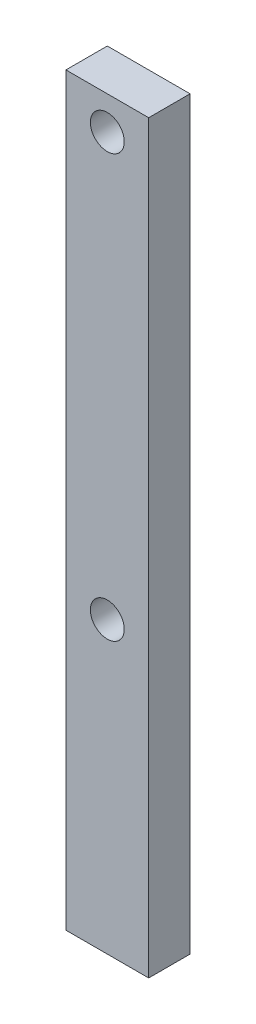
ISO-10303-21;
HEADER;
FILE_DESCRIPTION(('STEP AP214'),'2;1');
FILE_NAME('part.step','',(''),(''),'','','');
FILE_SCHEMA(('AUTOMOTIVE_DESIGN { 1 0 10303 214 1 1 1 1 }'));
ENDSEC;
DATA;
#1=APPLICATION_CONTEXT('core data for automotive mechanical design processes');
#2=APPLICATION_PROTOCOL_DEFINITION('international standard','automotive_design',2000,#1);
#3=PRODUCT_CONTEXT('',#1,'mechanical');
#4=PRODUCT('Part','Part','',(#3));
#5=PRODUCT_RELATED_PRODUCT_CATEGORY('part','',(#4));
#6=PRODUCT_DEFINITION_FORMATION('','',#4);
#7=PRODUCT_DEFINITION_CONTEXT('part definition',#1,'design');
#8=PRODUCT_DEFINITION('design','',#6,#7);
#9=PRODUCT_DEFINITION_SHAPE('','',#8);
#10=(LENGTH_UNIT() NAMED_UNIT(*) SI_UNIT(.MILLI.,.METRE.));
#11=(NAMED_UNIT(*) PLANE_ANGLE_UNIT() SI_UNIT($,.RADIAN.));
#12=(NAMED_UNIT(*) SI_UNIT($,.STERADIAN.) SOLID_ANGLE_UNIT());
#13=UNCERTAINTY_MEASURE_WITH_UNIT(LENGTH_MEASURE(1.E-05),#10,'distance_accuracy_value','');
#14=(GEOMETRIC_REPRESENTATION_CONTEXT(3) GLOBAL_UNCERTAINTY_ASSIGNED_CONTEXT((#13)) GLOBAL_UNIT_ASSIGNED_CONTEXT((#10,
#11,#12)) REPRESENTATION_CONTEXT('',''));
#15=CARTESIAN_POINT('',(0.,0.,0.));
#16=DIRECTION('',(0.,0.,1.));
#17=DIRECTION('',(1.,0.,0.));
#18=AXIS2_PLACEMENT_3D('',#15,#16,#17);
#19=CARTESIAN_POINT('',(6.34999999999999,57.15,6.35));
#20=DIRECTION('',(-1.,0.,0.));
#21=DIRECTION('',(0.,-1.,0.));
#22=AXIS2_PLACEMENT_3D('',#19,#20,#21);
#23=PLANE('',#22);
#24=DIRECTION('',(0.,1.,0.));
#25=VECTOR('',#24,1.);
#26=CARTESIAN_POINT('',(6.34999999999999,57.15,0.));
#27=LINE('',#26,#25);
#28=CARTESIAN_POINT('',(6.35000000000001,-57.15,0.));
#29=VERTEX_POINT('',#28);
#30=CARTESIAN_POINT('',(6.34999999999999,57.15,0.));
#31=VERTEX_POINT('',#30);
#32=EDGE_CURVE('E107',#29,#31,#27,.T.);
#33=ORIENTED_EDGE('',*,*,#32,.T.);
#34=DIRECTION('',(0.,0.,-1.));
#35=VECTOR('',#34,1.);
#36=CARTESIAN_POINT('',(6.34999999999999,57.15,6.35));
#37=LINE('',#36,#35);
#38=CARTESIAN_POINT('',(6.34999999999999,57.15,6.35));
#39=VERTEX_POINT('',#38);
#40=EDGE_CURVE('E11',#39,#31,#37,.T.);
#41=ORIENTED_EDGE('',*,*,#40,.F.);
#42=DIRECTION('',(0.,1.,0.));
#43=VECTOR('',#42,1.);
#44=CARTESIAN_POINT('',(6.34999999999999,57.15,6.35));
#45=LINE('',#44,#43);
#46=CARTESIAN_POINT('',(6.35000000000001,-57.15,6.35));
#47=VERTEX_POINT('',#46);
#48=EDGE_CURVE('E91',#47,#39,#45,.T.);
#49=ORIENTED_EDGE('',*,*,#48,.F.);
#50=DIRECTION('',(0.,0.,-1.));
#51=VECTOR('',#50,1.);
#52=CARTESIAN_POINT('',(6.35000000000001,-57.15,6.35));
#53=LINE('',#52,#51);
#54=EDGE_CURVE('E103',#47,#29,#53,.T.);
#55=ORIENTED_EDGE('',*,*,#54,.T.);
#56=EDGE_LOOP('',(#33,#41,#49,#55));
#57=FACE_BOUND('',#56,.T.);
#58=ADVANCED_FACE('F39',(#57),#23,.F.);
#59=CARTESIAN_POINT('',(-6.35000000000001,57.15,6.35));
#60=DIRECTION('',(0.,-1.,0.));
#61=DIRECTION('',(0.,0.,-1.));
#62=AXIS2_PLACEMENT_3D('',#59,#60,#61);
#63=PLANE('',#62);
#64=DIRECTION('',(-1.,0.,0.));
#65=VECTOR('',#64,1.);
#66=CARTESIAN_POINT('',(-6.35000000000001,57.15,0.));
#67=LINE('',#66,#65);
#68=CARTESIAN_POINT('',(-6.35000000000001,57.15,0.));
#69=VERTEX_POINT('',#68);
#70=EDGE_CURVE('E96',#31,#69,#67,.T.);
#71=ORIENTED_EDGE('',*,*,#70,.T.);
#72=DIRECTION('',(0.,0.,-1.));
#73=VECTOR('',#72,1.);
#74=CARTESIAN_POINT('',(-6.35000000000001,57.15,6.35));
#75=LINE('',#74,#73);
#76=CARTESIAN_POINT('',(-6.35000000000001,57.15,6.35));
#77=VERTEX_POINT('',#76);
#78=EDGE_CURVE('E48',#77,#69,#75,.T.);
#79=ORIENTED_EDGE('',*,*,#78,.F.);
#80=DIRECTION('',(-1.,0.,0.));
#81=VECTOR('',#80,1.);
#82=CARTESIAN_POINT('',(-6.35000000000001,57.15,6.35));
#83=LINE('',#82,#81);
#84=EDGE_CURVE('E86',#39,#77,#83,.T.);
#85=ORIENTED_EDGE('',*,*,#84,.F.);
#86=ORIENTED_EDGE('',*,*,#40,.T.);
#87=EDGE_LOOP('',(#71,#79,#85,#86));
#88=FACE_BOUND('',#87,.T.);
#89=ADVANCED_FACE('F95',(#88),#63,.F.);
#90=CARTESIAN_POINT('',(-6.35000000000001,57.15,6.35));
#91=DIRECTION('',(1.,0.,0.));
#92=DIRECTION('',(0.,1.,0.));
#93=AXIS2_PLACEMENT_3D('',#90,#91,#92);
#94=PLANE('',#93);
#95=DIRECTION('',(0.,-1.,0.));
#96=VECTOR('',#95,1.);
#97=CARTESIAN_POINT('',(-6.35000000000001,57.15,0.));
#98=LINE('',#97,#96);
#99=CARTESIAN_POINT('',(-6.34999999999999,-57.15,0.));
#100=VERTEX_POINT('',#99);
#101=EDGE_CURVE('E73',#69,#100,#98,.T.);
#102=ORIENTED_EDGE('',*,*,#101,.T.);
#103=DIRECTION('',(0.,0.,-1.));
#104=VECTOR('',#103,1.);
#105=CARTESIAN_POINT('',(-6.34999999999999,-57.15,6.35));
#106=LINE('',#105,#104);
#107=CARTESIAN_POINT('',(-6.34999999999999,-57.15,6.35));
#108=VERTEX_POINT('',#107);
#109=EDGE_CURVE('E98',#108,#100,#106,.T.);
#110=ORIENTED_EDGE('',*,*,#109,.F.);
#111=DIRECTION('',(0.,-1.,0.));
#112=VECTOR('',#111,1.);
#113=CARTESIAN_POINT('',(-6.35000000000001,57.15,6.35));
#114=LINE('',#113,#112);
#115=EDGE_CURVE('E89',#77,#108,#114,.T.);
#116=ORIENTED_EDGE('',*,*,#115,.F.);
#117=ORIENTED_EDGE('',*,*,#78,.T.);
#118=EDGE_LOOP('',(#102,#110,#116,#117));
#119=FACE_BOUND('',#118,.T.);
#120=ADVANCED_FACE('F99',(#119),#94,.F.);
#121=CARTESIAN_POINT('',(-6.34999999999999,-57.15,6.35));
#122=DIRECTION('',(0.,1.,0.));
#123=DIRECTION('',(0.,0.,1.));
#124=AXIS2_PLACEMENT_3D('',#121,#122,#123);
#125=PLANE('',#124);
#126=DIRECTION('',(1.,0.,0.));
#127=VECTOR('',#126,1.);
#128=CARTESIAN_POINT('',(-6.34999999999999,-57.15,0.));
#129=LINE('',#128,#127);
#130=EDGE_CURVE('E79',#100,#29,#129,.T.);
#131=ORIENTED_EDGE('',*,*,#130,.T.);
#132=ORIENTED_EDGE('',*,*,#54,.F.);
#133=DIRECTION('',(1.,0.,0.));
#134=VECTOR('',#133,1.);
#135=CARTESIAN_POINT('',(-6.34999999999999,-57.15,6.35));
#136=LINE('',#135,#134);
#137=EDGE_CURVE('E56',#108,#47,#136,.T.);
#138=ORIENTED_EDGE('',*,*,#137,.F.);
#139=ORIENTED_EDGE('',*,*,#109,.T.);
#140=EDGE_LOOP('',(#131,#132,#138,#139));
#141=FACE_BOUND('',#140,.T.);
#142=ADVANCED_FACE('F121',(#141),#125,.F.);
#143=CARTESIAN_POINT('',(0.,0.,6.35));
#144=DIRECTION('',(0.,0.,1.));
#145=DIRECTION('',(1.,0.,0.));
#146=AXIS2_PLACEMENT_3D('',#143,#144,#145);
#147=PLANE('',#146);
#148=CARTESIAN_POINT('',(0.,-12.7,6.35));
#149=DIRECTION('',(0.,0.,1.));
#150=DIRECTION('',(1.,0.,0.));
#151=AXIS2_PLACEMENT_3D('',#148,#149,#150);
#152=CIRCLE('',#151,2.6);
#153=CARTESIAN_POINT('',(2.6,-12.7,6.35));
#154=VERTEX_POINT('',#153);
#155=EDGE_CURVE('E136',#154,#154,#152,.T.);
#156=ORIENTED_EDGE('',*,*,#155,.F.);
#157=EDGE_LOOP('',(#156));
#158=FACE_BOUND('',#157,.T.);
#159=CARTESIAN_POINT('',(0.,52.07,6.35));
#160=DIRECTION('',(0.,0.,1.));
#161=DIRECTION('',(1.,0.,0.));
#162=AXIS2_PLACEMENT_3D('',#159,#160,#161);
#163=CIRCLE('',#162,2.6);
#164=CARTESIAN_POINT('',(2.6,52.07,6.35));
#165=VERTEX_POINT('',#164);
#166=EDGE_CURVE('E128',#165,#165,#163,.T.);
#167=ORIENTED_EDGE('',*,*,#166,.F.);
#168=EDGE_LOOP('',(#167));
#169=FACE_BOUND('',#168,.T.);
#170=ORIENTED_EDGE('',*,*,#48,.T.);
#171=ORIENTED_EDGE('',*,*,#84,.T.);
#172=ORIENTED_EDGE('',*,*,#115,.T.);
#173=ORIENTED_EDGE('',*,*,#137,.T.);
#174=EDGE_LOOP('',(#170,#171,#172,#173));
#175=FACE_BOUND('',#174,.T.);
#176=ADVANCED_FACE('F87',(#158,#169,#175),#147,.T.);
#177=CARTESIAN_POINT('',(0.,0.,0.));
#178=DIRECTION('',(0.,0.,1.));
#179=DIRECTION('',(1.,0.,0.));
#180=AXIS2_PLACEMENT_3D('',#177,#178,#179);
#181=PLANE('',#180);
#182=CARTESIAN_POINT('',(0.,-12.7,0.));
#183=DIRECTION('',(0.,0.,1.));
#184=DIRECTION('',(1.,0.,0.));
#185=AXIS2_PLACEMENT_3D('',#182,#183,#184);
#186=CIRCLE('',#185,2.6);
#187=CARTESIAN_POINT('',(2.6,-12.7,0.));
#188=VERTEX_POINT('',#187);
#189=EDGE_CURVE('E111',#188,#188,#186,.T.);
#190=ORIENTED_EDGE('',*,*,#189,.T.);
#191=EDGE_LOOP('',(#190));
#192=FACE_BOUND('',#191,.T.);
#193=CARTESIAN_POINT('',(0.,52.07,0.));
#194=DIRECTION('',(0.,0.,1.));
#195=DIRECTION('',(1.,0.,0.));
#196=AXIS2_PLACEMENT_3D('',#193,#194,#195);
#197=CIRCLE('',#196,2.6);
#198=CARTESIAN_POINT('',(2.6,52.07,0.));
#199=VERTEX_POINT('',#198);
#200=EDGE_CURVE('E132',#199,#199,#197,.T.);
#201=ORIENTED_EDGE('',*,*,#200,.T.);
#202=EDGE_LOOP('',(#201));
#203=FACE_BOUND('',#202,.T.);
#204=ORIENTED_EDGE('',*,*,#32,.F.);
#205=ORIENTED_EDGE('',*,*,#130,.F.);
#206=ORIENTED_EDGE('',*,*,#101,.F.);
#207=ORIENTED_EDGE('',*,*,#70,.F.);
#208=EDGE_LOOP('',(#204,#205,#206,#207));
#209=FACE_BOUND('',#208,.T.);
#210=ADVANCED_FACE('F124',(#192,#203,#209),#181,.F.);
#211=CARTESIAN_POINT('',(0.,52.07,0.));
#212=DIRECTION('',(0.,0.,1.));
#213=DIRECTION('',(1.,0.,0.));
#214=AXIS2_PLACEMENT_3D('',#211,#212,#213);
#215=CYLINDRICAL_SURFACE('',#214,2.6);
#216=ORIENTED_EDGE('',*,*,#200,.F.);
#217=EDGE_LOOP('',(#216));
#218=FACE_BOUND('',#217,.T.);
#219=ORIENTED_EDGE('',*,*,#166,.T.);
#220=EDGE_LOOP('',(#219));
#221=FACE_BOUND('',#220,.T.);
#222=ADVANCED_FACE('F149',(#218,#221),#215,.F.);
#223=CARTESIAN_POINT('',(0.,-12.7,0.));
#224=DIRECTION('',(0.,0.,1.));
#225=DIRECTION('',(1.,0.,0.));
#226=AXIS2_PLACEMENT_3D('',#223,#224,#225);
#227=CYLINDRICAL_SURFACE('',#226,2.6);
#228=ORIENTED_EDGE('',*,*,#189,.F.);
#229=EDGE_LOOP('',(#228));
#230=FACE_BOUND('',#229,.T.);
#231=ORIENTED_EDGE('',*,*,#155,.T.);
#232=EDGE_LOOP('',(#231));
#233=FACE_BOUND('',#232,.T.);
#234=ADVANCED_FACE('F146',(#230,#233),#227,.F.);
#235=CLOSED_SHELL('',(#58,#89,#120,#142,#176,#210,#222,#234));
#236=MANIFOLD_SOLID_BREP('B2',#235);
#237=ADVANCED_BREP_SHAPE_REPRESENTATION('',(#18,#236),#14);
#238=SHAPE_DEFINITION_REPRESENTATION(#9,#237);
ENDSEC;
END-ISO-10303-21;
